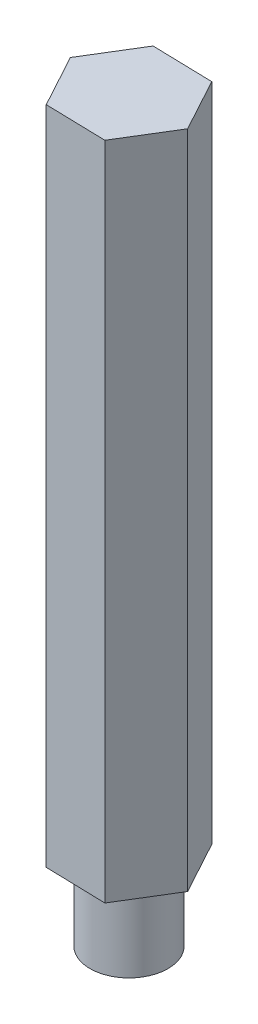
ISO-10303-21;
HEADER;
FILE_DESCRIPTION(('STEP AP214'),'2;1');
FILE_NAME('part.step','',(''),(''),'','','');
FILE_SCHEMA(('AUTOMOTIVE_DESIGN { 1 0 10303 214 1 1 1 1 }'));
ENDSEC;
DATA;
#1=APPLICATION_CONTEXT('core data for automotive mechanical design processes');
#2=APPLICATION_PROTOCOL_DEFINITION('international standard','automotive_design',2000,#1);
#3=PRODUCT_CONTEXT('',#1,'mechanical');
#4=PRODUCT('Part','Part','',(#3));
#5=PRODUCT_RELATED_PRODUCT_CATEGORY('part','',(#4));
#6=PRODUCT_DEFINITION_FORMATION('','',#4);
#7=PRODUCT_DEFINITION_CONTEXT('part definition',#1,'design');
#8=PRODUCT_DEFINITION('design','',#6,#7);
#9=PRODUCT_DEFINITION_SHAPE('','',#8);
#10=(LENGTH_UNIT() NAMED_UNIT(*) SI_UNIT(.MILLI.,.METRE.));
#11=(NAMED_UNIT(*) PLANE_ANGLE_UNIT() SI_UNIT($,.RADIAN.));
#12=(NAMED_UNIT(*) SI_UNIT($,.STERADIAN.) SOLID_ANGLE_UNIT());
#13=UNCERTAINTY_MEASURE_WITH_UNIT(LENGTH_MEASURE(1.E-05),#10,'distance_accuracy_value','');
#14=(GEOMETRIC_REPRESENTATION_CONTEXT(3) GLOBAL_UNCERTAINTY_ASSIGNED_CONTEXT((#13)) GLOBAL_UNIT_ASSIGNED_CONTEXT((#10,
#11,#12)) REPRESENTATION_CONTEXT('',''));
#15=CARTESIAN_POINT('',(0.,0.,0.));
#16=DIRECTION('',(0.,0.,1.));
#17=DIRECTION('',(1.,0.,0.));
#18=AXIS2_PLACEMENT_3D('',#15,#16,#17);
#19=CARTESIAN_POINT('',(-3.82765449643494,90.,6.25399027735531));
#20=DIRECTION('',(0.0256194716095924,0.,-0.999671767468925));
#21=DIRECTION('',(-0.999671767468926,0.,-0.0256194716095924));
#22=AXIS2_PLACEMENT_3D('',#19,#20,#21);
#23=PLANE('',#22);
#24=DIRECTION('',(-0.999671767468926,0.,-0.0256194716095924));
#25=VECTOR('',#24,1.);
#26=CARTESIAN_POINT('',(-3.82765449643494,9.52500000000001,6.25399027735531));
#27=LINE('',#26,#25);
#28=CARTESIAN_POINT('',(3.50228720699311,9.52500000000001,6.44184116950004));
#29=VERTEX_POINT('',#28);
#30=CARTESIAN_POINT('',(-3.82765449643494,9.52500000000003,6.25399027735531));
#31=VERTEX_POINT('',#30);
#32=EDGE_CURVE('E60',#29,#31,#27,.T.);
#33=ORIENTED_EDGE('',*,*,#32,.F.);
#34=DIRECTION('',(0.,-1.,0.));
#35=VECTOR('',#34,1.);
#36=CARTESIAN_POINT('',(3.50228720699311,90.,6.44184116950004));
#37=LINE('',#36,#35);
#38=CARTESIAN_POINT('',(3.50228720699311,90.,6.44184116950004));
#39=VERTEX_POINT('',#38);
#40=EDGE_CURVE('E54',#39,#29,#37,.T.);
#41=ORIENTED_EDGE('',*,*,#40,.F.);
#42=DIRECTION('',(0.999671767468925,0.,0.0256194716095924));
#43=VECTOR('',#42,1.);
#44=CARTESIAN_POINT('',(-3.82765449643494,90.,6.25399027735531));
#45=LINE('',#44,#43);
#46=CARTESIAN_POINT('',(-3.82765449643494,90.,6.25399027735531));
#47=VERTEX_POINT('',#46);
#48=EDGE_CURVE('E143',#47,#39,#45,.T.);
#49=ORIENTED_EDGE('',*,*,#48,.F.);
#50=DIRECTION('',(0.,-1.,0.));
#51=VECTOR('',#50,1.);
#52=CARTESIAN_POINT('',(-3.82765449643494,90.,6.25399027735531));
#53=LINE('',#52,#51);
#54=EDGE_CURVE('E117',#47,#31,#53,.T.);
#55=ORIENTED_EDGE('',*,*,#54,.T.);
#56=EDGE_LOOP('',(#33,#41,#49,#55));
#57=FACE_BOUND('',#56,.T.);
#58=ADVANCED_FACE('F46',(#57),#23,.F.);
#59=CARTESIAN_POINT('',(3.50228720699311,90.,6.44184116950004));
#60=DIRECTION('',(-0.852931410269384,0.,-0.522022996979904));
#61=DIRECTION('',(-0.522022996979904,0.,0.852931410269384));
#62=AXIS2_PLACEMENT_3D('',#59,#60,#61);
#63=PLANE('',#62);
#64=DIRECTION('',(-0.522022996979904,0.,0.852931410269384));
#65=VECTOR('',#64,1.);
#66=CARTESIAN_POINT('',(3.50228720699311,9.52500000000001,6.44184116950004));
#67=LINE('',#66,#65);
#68=CARTESIAN_POINT('',(7.32994170342805,9.52500000000001,0.187850892144734));
#69=VERTEX_POINT('',#68);
#70=EDGE_CURVE('E139',#69,#29,#67,.T.);
#71=ORIENTED_EDGE('',*,*,#70,.F.);
#72=DIRECTION('',(0.,-1.,0.));
#73=VECTOR('',#72,1.);
#74=CARTESIAN_POINT('',(7.32994170342805,90.,0.187850892144734));
#75=LINE('',#74,#73);
#76=CARTESIAN_POINT('',(7.32994170342805,90.,0.187850892144734));
#77=VERTEX_POINT('',#76);
#78=EDGE_CURVE('E129',#77,#69,#75,.T.);
#79=ORIENTED_EDGE('',*,*,#78,.F.);
#80=DIRECTION('',(0.522022996979904,0.,-0.852931410269384));
#81=VECTOR('',#80,1.);
#82=CARTESIAN_POINT('',(3.50228720699311,90.,6.44184116950004));
#83=LINE('',#82,#81);
#84=EDGE_CURVE('E140',#39,#77,#83,.T.);
#85=ORIENTED_EDGE('',*,*,#84,.F.);
#86=ORIENTED_EDGE('',*,*,#40,.T.);
#87=EDGE_LOOP('',(#71,#79,#85,#86));
#88=FACE_BOUND('',#87,.T.);
#89=ADVANCED_FACE('F137',(#88),#63,.F.);
#90=CARTESIAN_POINT('',(7.32994170342805,90.,0.187850892144734));
#91=DIRECTION('',(-0.878550881878976,0.,0.477648770489022));
#92=DIRECTION('',(0.477648770489022,0.,0.878550881878976));
#93=AXIS2_PLACEMENT_3D('',#90,#91,#92);
#94=PLANE('',#93);
#95=DIRECTION('',(0.477648770489022,0.,0.878550881878976));
#96=VECTOR('',#95,1.);
#97=CARTESIAN_POINT('',(7.32994170342805,9.52500000000001,0.187850892144734));
#98=LINE('',#97,#96);
#99=CARTESIAN_POINT('',(3.82765449643493,9.52500000000001,-6.25399027735531));
#100=VERTEX_POINT('',#99);
#101=EDGE_CURVE('E149',#100,#69,#98,.T.);
#102=ORIENTED_EDGE('',*,*,#101,.F.);
#103=DIRECTION('',(0.,-1.,0.));
#104=VECTOR('',#103,1.);
#105=CARTESIAN_POINT('',(3.82765449643493,90.,-6.25399027735531));
#106=LINE('',#105,#104);
#107=CARTESIAN_POINT('',(3.82765449643493,90.,-6.25399027735531));
#108=VERTEX_POINT('',#107);
#109=EDGE_CURVE('E121',#108,#100,#106,.T.);
#110=ORIENTED_EDGE('',*,*,#109,.F.);
#111=DIRECTION('',(-0.477648770489022,0.,-0.878550881878976));
#112=VECTOR('',#111,1.);
#113=CARTESIAN_POINT('',(7.32994170342805,90.,0.187850892144734));
#114=LINE('',#113,#112);
#115=EDGE_CURVE('E155',#77,#108,#114,.T.);
#116=ORIENTED_EDGE('',*,*,#115,.F.);
#117=ORIENTED_EDGE('',*,*,#78,.T.);
#118=EDGE_LOOP('',(#102,#110,#116,#117));
#119=FACE_BOUND('',#118,.T.);
#120=ADVANCED_FACE('F200',(#119),#94,.F.);
#121=CARTESIAN_POINT('',(3.82765449643493,90.,-6.25399027735531));
#122=DIRECTION('',(-0.0256194716095925,0.,0.999671767468925));
#123=DIRECTION('',(0.999671767468926,0.,0.0256194716095925));
#124=AXIS2_PLACEMENT_3D('',#121,#122,#123);
#125=PLANE('',#124);
#126=DIRECTION('',(0.999671767468926,0.,0.0256194716095925));
#127=VECTOR('',#126,1.);
#128=CARTESIAN_POINT('',(3.82765449643493,9.52500000000001,-6.25399027735531));
#129=LINE('',#128,#127);
#130=CARTESIAN_POINT('',(-3.50228720699311,9.52500000000001,-6.44184116950005));
#131=VERTEX_POINT('',#130);
#132=EDGE_CURVE('E112',#131,#100,#129,.T.);
#133=ORIENTED_EDGE('',*,*,#132,.F.);
#134=DIRECTION('',(0.,-1.,0.));
#135=VECTOR('',#134,1.);
#136=CARTESIAN_POINT('',(-3.50228720699311,90.,-6.44184116950005));
#137=LINE('',#136,#135);
#138=CARTESIAN_POINT('',(-3.50228720699311,90.,-6.44184116950005));
#139=VERTEX_POINT('',#138);
#140=EDGE_CURVE('E110',#139,#131,#137,.T.);
#141=ORIENTED_EDGE('',*,*,#140,.F.);
#142=DIRECTION('',(-0.999671767468925,0.,-0.0256194716095925));
#143=VECTOR('',#142,1.);
#144=CARTESIAN_POINT('',(3.82765449643493,90.,-6.25399027735531));
#145=LINE('',#144,#143);
#146=EDGE_CURVE('E158',#108,#139,#145,.T.);
#147=ORIENTED_EDGE('',*,*,#146,.F.);
#148=ORIENTED_EDGE('',*,*,#109,.T.);
#149=EDGE_LOOP('',(#133,#141,#147,#148));
#150=FACE_BOUND('',#149,.T.);
#151=ADVANCED_FACE('F169',(#150),#125,.F.);
#152=CARTESIAN_POINT('',(-3.50228720699311,90.,-6.44184116950005));
#153=DIRECTION('',(0.852931410269383,0.,0.522022996979904));
#154=DIRECTION('',(0.522022996979904,0.,-0.852931410269383));
#155=AXIS2_PLACEMENT_3D('',#152,#153,#154);
#156=PLANE('',#155);
#157=DIRECTION('',(0.522022996979904,0.,-0.852931410269383));
#158=VECTOR('',#157,1.);
#159=CARTESIAN_POINT('',(-3.50228720699311,9.52500000000001,-6.44184116950005));
#160=LINE('',#159,#158);
#161=CARTESIAN_POINT('',(-7.32994170342805,9.52500000000001,-0.187850892144734));
#162=VERTEX_POINT('',#161);
#163=EDGE_CURVE('E98',#162,#131,#160,.T.);
#164=ORIENTED_EDGE('',*,*,#163,.F.);
#165=DIRECTION('',(0.,-1.,0.));
#166=VECTOR('',#165,1.);
#167=CARTESIAN_POINT('',(-7.32994170342805,90.,-0.187850892144734));
#168=LINE('',#167,#166);
#169=CARTESIAN_POINT('',(-7.32994170342805,90.,-0.187850892144734));
#170=VERTEX_POINT('',#169);
#171=EDGE_CURVE('E108',#170,#162,#168,.T.);
#172=ORIENTED_EDGE('',*,*,#171,.F.);
#173=DIRECTION('',(-0.522022996979904,0.,0.852931410269383));
#174=VECTOR('',#173,1.);
#175=CARTESIAN_POINT('',(-3.50228720699311,90.,-6.44184116950005));
#176=LINE('',#175,#174);
#177=EDGE_CURVE('E161',#139,#170,#176,.T.);
#178=ORIENTED_EDGE('',*,*,#177,.F.);
#179=ORIENTED_EDGE('',*,*,#140,.T.);
#180=EDGE_LOOP('',(#164,#172,#178,#179));
#181=FACE_BOUND('',#180,.T.);
#182=ADVANCED_FACE('F106',(#181),#156,.F.);
#183=CARTESIAN_POINT('',(-7.32994170342805,90.,-0.187850892144734));
#184=DIRECTION('',(0.878550881878976,0.,-0.477648770489022));
#185=DIRECTION('',(-0.477648770489022,0.,-0.878550881878976));
#186=AXIS2_PLACEMENT_3D('',#183,#184,#185);
#187=PLANE('',#186);
#188=DIRECTION('',(-0.477648770489022,0.,-0.878550881878976));
#189=VECTOR('',#188,1.);
#190=CARTESIAN_POINT('',(-7.32994170342805,9.52500000000001,-0.187850892144734));
#191=LINE('',#190,#189);
#192=EDGE_CURVE('E12',#31,#162,#191,.T.);
#193=ORIENTED_EDGE('',*,*,#192,.F.);
#194=ORIENTED_EDGE('',*,*,#54,.F.);
#195=DIRECTION('',(0.477648770489022,0.,0.878550881878976));
#196=VECTOR('',#195,1.);
#197=CARTESIAN_POINT('',(-7.32994170342805,90.,-0.187850892144734));
#198=LINE('',#197,#196);
#199=EDGE_CURVE('E68',#170,#47,#198,.T.);
#200=ORIENTED_EDGE('',*,*,#199,.F.);
#201=ORIENTED_EDGE('',*,*,#171,.T.);
#202=EDGE_LOOP('',(#193,#194,#200,#201));
#203=FACE_BOUND('',#202,.T.);
#204=ADVANCED_FACE('F115',(#203),#187,.F.);
#205=CARTESIAN_POINT('',(0.,90.,0.));
#206=DIRECTION('',(0.,1.,0.));
#207=DIRECTION('',(0.,0.,1.));
#208=AXIS2_PLACEMENT_3D('',#205,#206,#207);
#209=PLANE('',#208);
#210=ORIENTED_EDGE('',*,*,#48,.T.);
#211=ORIENTED_EDGE('',*,*,#84,.T.);
#212=ORIENTED_EDGE('',*,*,#115,.T.);
#213=ORIENTED_EDGE('',*,*,#146,.T.);
#214=ORIENTED_EDGE('',*,*,#177,.T.);
#215=ORIENTED_EDGE('',*,*,#199,.T.);
#216=EDGE_LOOP('',(#210,#211,#212,#213,#214,#215));
#217=FACE_BOUND('',#216,.T.);
#218=ADVANCED_FACE('F164',(#217),#209,.T.);
#219=CARTESIAN_POINT('',(0.,9.525,0.));
#220=DIRECTION('',(0.,-1.,0.));
#221=DIRECTION('',(0.,0.,-1.));
#222=AXIS2_PLACEMENT_3D('',#219,#220,#221);
#223=PLANE('',#222);
#224=CARTESIAN_POINT('',(0.,9.525,0.));
#225=DIRECTION('',(0.,-1.,0.));
#226=DIRECTION('',(0.,0.,-1.));
#227=AXIS2_PLACEMENT_3D('',#224,#225,#226);
#228=CIRCLE('',#227,4.75);
#229=CARTESIAN_POINT('',(0.,9.525,-4.75));
#230=VERTEX_POINT('',#229);
#231=EDGE_CURVE('E113',#230,#230,#228,.T.);
#232=ORIENTED_EDGE('',*,*,#231,.F.);
#233=EDGE_LOOP('',(#232));
#234=FACE_BOUND('',#233,.T.);
#235=ORIENTED_EDGE('',*,*,#32,.T.);
#236=ORIENTED_EDGE('',*,*,#192,.T.);
#237=ORIENTED_EDGE('',*,*,#163,.T.);
#238=ORIENTED_EDGE('',*,*,#132,.T.);
#239=ORIENTED_EDGE('',*,*,#101,.T.);
#240=ORIENTED_EDGE('',*,*,#70,.T.);
#241=EDGE_LOOP('',(#235,#236,#237,#238,#239,#240));
#242=FACE_BOUND('',#241,.T.);
#243=ADVANCED_FACE('F97',(#234,#242),#223,.T.);
#244=CARTESIAN_POINT('',(0.,9.525,0.));
#245=DIRECTION('',(0.,-1.,0.));
#246=DIRECTION('',(0.,0.,-1.));
#247=AXIS2_PLACEMENT_3D('',#244,#245,#246);
#248=CYLINDRICAL_SURFACE('',#247,4.75);
#249=CARTESIAN_POINT('',(0.,0.,0.));
#250=DIRECTION('',(0.,-1.,0.));
#251=DIRECTION('',(0.,0.,-1.));
#252=AXIS2_PLACEMENT_3D('',#249,#250,#251);
#253=CIRCLE('',#252,4.75);
#254=CARTESIAN_POINT('',(0.,0.,-4.75));
#255=VERTEX_POINT('',#254);
#256=EDGE_CURVE('E175',#255,#255,#253,.T.);
#257=CARTESIAN_POINT('',(0.,9.525,-4.75));
#258=CARTESIAN_POINT('',(0.,9.42578125,-4.75));
#259=CARTESIAN_POINT('',(0.,9.3265625,-4.75));
#260=CARTESIAN_POINT('',(0.,9.128125,-4.75));
#261=CARTESIAN_POINT('',(0.,9.02890625,-4.75));
#262=CARTESIAN_POINT('',(0.,8.83046875,-4.75));
#263=CARTESIAN_POINT('',(0.,8.73125,-4.75));
#264=CARTESIAN_POINT('',(0.,8.5328125,-4.75));
#265=CARTESIAN_POINT('',(0.,8.43359375,-4.75));
#266=CARTESIAN_POINT('',(0.,8.23515625,-4.75));
#267=CARTESIAN_POINT('',(0.,8.1359375,-4.75));
#268=CARTESIAN_POINT('',(0.,7.9375,-4.75));
#269=CARTESIAN_POINT('',(0.,7.83828125,-4.75));
#270=CARTESIAN_POINT('',(0.,7.63984375,-4.75));
#271=CARTESIAN_POINT('',(0.,7.540625,-4.75));
#272=CARTESIAN_POINT('',(0.,7.3421875,-4.75));
#273=CARTESIAN_POINT('',(0.,7.24296875,-4.75));
#274=CARTESIAN_POINT('',(0.,7.04453125,-4.75));
#275=CARTESIAN_POINT('',(0.,6.9453125,-4.75));
#276=CARTESIAN_POINT('',(0.,6.746875,-4.75));
#277=CARTESIAN_POINT('',(0.,6.64765625,-4.75));
#278=CARTESIAN_POINT('',(0.,6.44921875,-4.75));
#279=CARTESIAN_POINT('',(0.,6.35,-4.75));
#280=CARTESIAN_POINT('',(0.,6.1515625,-4.75));
#281=CARTESIAN_POINT('',(0.,6.05234375,-4.75));
#282=CARTESIAN_POINT('',(0.,5.85390625,-4.75));
#283=CARTESIAN_POINT('',(0.,5.7546875,-4.75));
#284=CARTESIAN_POINT('',(0.,5.55625,-4.75));
#285=CARTESIAN_POINT('',(0.,5.45703125,-4.75));
#286=CARTESIAN_POINT('',(0.,5.25859375,-4.75));
#287=CARTESIAN_POINT('',(0.,5.159375,-4.75));
#288=CARTESIAN_POINT('',(0.,4.9609375,-4.75));
#289=CARTESIAN_POINT('',(0.,4.86171875,-4.75));
#290=CARTESIAN_POINT('',(0.,4.66328125,-4.75));
#291=CARTESIAN_POINT('',(0.,4.5640625,-4.75));
#292=CARTESIAN_POINT('',(0.,4.365625,-4.75));
#293=CARTESIAN_POINT('',(0.,4.26640625,-4.75));
#294=CARTESIAN_POINT('',(0.,4.06796875,-4.75));
#295=CARTESIAN_POINT('',(0.,3.96875,-4.75));
#296=CARTESIAN_POINT('',(0.,3.7703125,-4.75));
#297=CARTESIAN_POINT('',(0.,3.67109375,-4.75));
#298=CARTESIAN_POINT('',(0.,3.47265625,-4.75));
#299=CARTESIAN_POINT('',(0.,3.3734375,-4.75));
#300=CARTESIAN_POINT('',(0.,3.175,-4.75));
#301=CARTESIAN_POINT('',(0.,3.07578125,-4.75));
#302=CARTESIAN_POINT('',(0.,2.87734375,-4.75));
#303=CARTESIAN_POINT('',(0.,2.778125,-4.75));
#304=CARTESIAN_POINT('',(0.,2.5796875,-4.75));
#305=CARTESIAN_POINT('',(0.,2.48046875,-4.75));
#306=CARTESIAN_POINT('',(0.,2.28203125,-4.75));
#307=CARTESIAN_POINT('',(0.,2.1828125,-4.75));
#308=CARTESIAN_POINT('',(0.,1.984375,-4.75));
#309=CARTESIAN_POINT('',(0.,1.88515625,-4.75));
#310=CARTESIAN_POINT('',(0.,1.68671875,-4.75));
#311=CARTESIAN_POINT('',(0.,1.5875,-4.75));
#312=CARTESIAN_POINT('',(0.,1.3890625,-4.75));
#313=CARTESIAN_POINT('',(0.,1.28984375,-4.75));
#314=CARTESIAN_POINT('',(0.,1.09140625,-4.75));
#315=CARTESIAN_POINT('',(0.,0.992187500000001,-4.75));
#316=CARTESIAN_POINT('',(0.,0.793750000000001,-4.75));
#317=CARTESIAN_POINT('',(0.,0.69453125,-4.75));
#318=CARTESIAN_POINT('',(0.,0.49609375,-4.75));
#319=CARTESIAN_POINT('',(0.,0.396875,-4.75));
#320=CARTESIAN_POINT('',(0.,0.1984375,-4.75));
#321=CARTESIAN_POINT('',(0.,0.0992187500000001,-4.75));
#322=CARTESIAN_POINT('',(0.,0.,-4.75));
#323=B_SPLINE_CURVE_WITH_KNOTS('',3,(#257,#258,#259,#260,#261,#262,#263,#264,#265,#266,#267,
#268,#269,#270,#271,#272,#273,#274,#275,#276,#277,#278,#279,#280,#281,#282,#283,#284,#285,#286,
#287,#288,#289,#290,#291,#292,#293,#294,#295,#296,#297,#298,#299,#300,#301,#302,#303,#304,#305,
#306,#307,#308,#309,#310,#311,#312,#313,#314,#315,#316,#317,#318,#319,#320,#321,#322),
.UNSPECIFIED.,.F.,.F.,(4,2,2,2,2,2,2,2,2,2,2,2,2,2,2,2,2,2,2,2,2,2,2,2,2,2,2,2,2,2,2,2,4),(0.,
0.297656249999998,0.595312499999999,0.892968749999999,1.190625,1.48828125,1.7859375,2.08359375,
2.38125,2.67890625,2.9765625,3.27421875,3.571875,3.86953125,4.1671875,4.46484375,4.7625,
5.06015625,5.3578125,5.65546875,5.953125,6.25078125,6.5484375,6.84609375,7.14375,7.44140625,
7.7390625,8.03671875,8.334375,8.63203125,8.9296875,9.22734375,9.525),.UNSPECIFIED.);
#324=EDGE_CURVE('BSEAM183',#230,#255,#323,.T.);
#325=ORIENTED_EDGE('',*,*,#231,.T.);
#326=ORIENTED_EDGE('',*,*,#256,.F.);
#327=ORIENTED_EDGE('',*,*,#324,.T.);
#328=ORIENTED_EDGE('',*,*,#324,.F.);
#329=EDGE_LOOP('',(#325,#327,#326,#328));
#330=FACE_BOUND('',#329,.T.);
#331=ADVANCED_FACE('F183',(#330),#248,.T.);
#332=CARTESIAN_POINT('',(0.,0.,0.));
#333=DIRECTION('',(0.,1.,0.));
#334=DIRECTION('',(0.,0.,1.));
#335=AXIS2_PLACEMENT_3D('',#332,#333,#334);
#336=PLANE('',#335);
#337=ORIENTED_EDGE('',*,*,#256,.T.);
#338=EDGE_LOOP('',(#337));
#339=FACE_BOUND('',#338,.T.);
#340=ADVANCED_FACE('F192',(#339),#336,.F.);
#341=CLOSED_SHELL('',(#58,#89,#120,#151,#182,#204,#218,#243,#331,#340));
#342=MANIFOLD_SOLID_BREP('B2',#341);
#343=ADVANCED_BREP_SHAPE_REPRESENTATION('',(#18,#342),#14);
#344=SHAPE_DEFINITION_REPRESENTATION(#9,#343);
ENDSEC;
END-ISO-10303-21;
